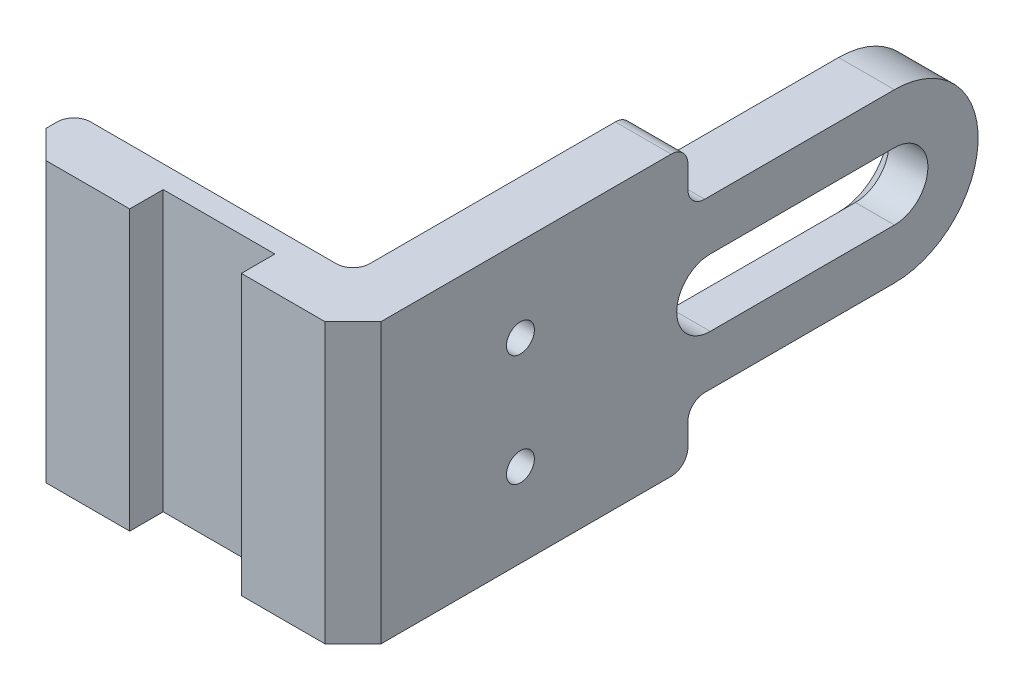
ISO-10303-21;
HEADER;
FILE_DESCRIPTION(('STEP AP214'),'2;1');
FILE_NAME('part.step','',(''),(''),'','','');
FILE_SCHEMA(('AUTOMOTIVE_DESIGN { 1 0 10303 214 1 1 1 1 }'));
ENDSEC;
DATA;
#1=APPLICATION_CONTEXT('core data for automotive mechanical design processes');
#2=APPLICATION_PROTOCOL_DEFINITION('international standard','automotive_design',2000,#1);
#3=PRODUCT_CONTEXT('',#1,'mechanical');
#4=PRODUCT('Part','Part','',(#3));
#5=PRODUCT_RELATED_PRODUCT_CATEGORY('part','',(#4));
#6=PRODUCT_DEFINITION_FORMATION('','',#4);
#7=PRODUCT_DEFINITION_CONTEXT('part definition',#1,'design');
#8=PRODUCT_DEFINITION('design','',#6,#7);
#9=PRODUCT_DEFINITION_SHAPE('','',#8);
#10=(LENGTH_UNIT() NAMED_UNIT(*) SI_UNIT(.MILLI.,.METRE.));
#11=(NAMED_UNIT(*) PLANE_ANGLE_UNIT() SI_UNIT($,.RADIAN.));
#12=(NAMED_UNIT(*) SI_UNIT($,.STERADIAN.) SOLID_ANGLE_UNIT());
#13=UNCERTAINTY_MEASURE_WITH_UNIT(LENGTH_MEASURE(1.E-05),#10,'distance_accuracy_value','');
#14=(GEOMETRIC_REPRESENTATION_CONTEXT(3) GLOBAL_UNCERTAINTY_ASSIGNED_CONTEXT((#13)) GLOBAL_UNIT_ASSIGNED_CONTEXT((#10,
#11,#12)) REPRESENTATION_CONTEXT('',''));
#15=CARTESIAN_POINT('',(0.,0.,0.));
#16=DIRECTION('',(0.,0.,1.));
#17=DIRECTION('',(1.,0.,0.));
#18=AXIS2_PLACEMENT_3D('',#15,#16,#17);
#19=CARTESIAN_POINT('',(0.,25.,0.));
#20=DIRECTION('',(0.,0.,1.));
#21=DIRECTION('',(1.,0.,0.));
#22=AXIS2_PLACEMENT_3D('',#19,#20,#21);
#23=PLANE('',#22);
#24=DIRECTION('',(-1.,0.,0.));
#25=VECTOR('',#24,1.);
#26=CARTESIAN_POINT('',(0.,0.,0.));
#27=LINE('',#26,#25);
#28=CARTESIAN_POINT('',(-2.50000000000002,0.,0.));
#29=VERTEX_POINT('',#28);
#30=CARTESIAN_POINT('',(-10.,0.,0.));
#31=VERTEX_POINT('',#30);
#32=EDGE_CURVE('E247',#29,#31,#27,.T.);
#33=ORIENTED_EDGE('',*,*,#32,.F.);
#34=DIRECTION('',(0.,1.,0.));
#35=VECTOR('',#34,1.);
#36=CARTESIAN_POINT('',(-2.50000000000002,25.,0.));
#37=LINE('',#36,#35);
#38=CARTESIAN_POINT('',(-2.50000000000002,25.,0.));
#39=VERTEX_POINT('',#38);
#40=EDGE_CURVE('E407',#29,#39,#37,.T.);
#41=ORIENTED_EDGE('',*,*,#40,.T.);
#42=DIRECTION('',(-1.,0.,0.));
#43=VECTOR('',#42,1.);
#44=CARTESIAN_POINT('',(0.,25.,0.));
#45=LINE('',#44,#43);
#46=CARTESIAN_POINT('',(-10.,25.,0.));
#47=VERTEX_POINT('',#46);
#48=EDGE_CURVE('E330',#39,#47,#45,.T.);
#49=ORIENTED_EDGE('',*,*,#48,.T.);
#50=DIRECTION('',(0.,1.,0.));
#51=VECTOR('',#50,1.);
#52=CARTESIAN_POINT('',(-10.,0.,0.));
#53=LINE('',#52,#51);
#54=EDGE_CURVE('E242',#31,#47,#53,.T.);
#55=ORIENTED_EDGE('',*,*,#54,.F.);
#56=EDGE_LOOP('',(#33,#41,#49,#55));
#57=FACE_BOUND('',#56,.T.);
#58=ADVANCED_FACE('F35',(#57),#23,.T.);
#59=CARTESIAN_POINT('',(0.,25.,0.));
#60=DIRECTION('',(0.,-1.,0.));
#61=DIRECTION('',(0.,0.,-1.));
#62=AXIS2_PLACEMENT_3D('',#59,#60,#61);
#63=PLANE('',#62);
#64=DIRECTION('',(-1.,0.,0.));
#65=VECTOR('',#64,1.);
#66=CARTESIAN_POINT('',(-5.,25.,-5.));
#67=LINE('',#66,#65);
#68=CARTESIAN_POINT('',(-6.5,25.,-5.));
#69=VERTEX_POINT('',#68);
#70=CARTESIAN_POINT('',(-28.5,25.,-5.));
#71=VERTEX_POINT('',#70);
#72=EDGE_CURVE('E336',#69,#71,#67,.T.);
#73=ORIENTED_EDGE('',*,*,#72,.T.);
#74=CARTESIAN_POINT('',(-28.5,25.,-3.5));
#75=DIRECTION('',(0.,-1.,0.));
#76=DIRECTION('',(0.,0.,-1.));
#77=AXIS2_PLACEMENT_3D('',#74,#75,#76);
#78=CIRCLE('',#77,1.5);
#79=CARTESIAN_POINT('',(-30.,25.,-3.5));
#80=VERTEX_POINT('',#79);
#81=EDGE_CURVE('E428',#71,#80,#78,.F.);
#82=ORIENTED_EDGE('',*,*,#81,.T.);
#83=DIRECTION('',(0.,0.,-1.));
#84=VECTOR('',#83,1.);
#85=CARTESIAN_POINT('',(-30.,25.,0.));
#86=LINE('',#85,#84);
#87=CARTESIAN_POINT('',(-30.,25.,-2.50000000000001));
#88=VERTEX_POINT('',#87);
#89=EDGE_CURVE('E332',#88,#80,#86,.T.);
#90=ORIENTED_EDGE('',*,*,#89,.F.);
#91=DIRECTION('',(-0.707106781186546,0.,-0.707106781186549));
#92=VECTOR('',#91,1.);
#93=CARTESIAN_POINT('',(-27.5,25.,0.));
#94=LINE('',#93,#92);
#95=CARTESIAN_POINT('',(-27.5,25.,0.));
#96=VERTEX_POINT('',#95);
#97=EDGE_CURVE('E409',#88,#96,#94,.F.);
#98=ORIENTED_EDGE('',*,*,#97,.T.);
#99=CARTESIAN_POINT('',(-20.,25.,0.));
#100=VERTEX_POINT('',#99);
#101=EDGE_CURVE('E333',#100,#96,#45,.T.);
#102=ORIENTED_EDGE('',*,*,#101,.F.);
#103=DIRECTION('',(0.,0.,1.));
#104=VECTOR('',#103,1.);
#105=CARTESIAN_POINT('',(-20.,25.,-3.));
#106=LINE('',#105,#104);
#107=CARTESIAN_POINT('',(-20.,25.,-3.));
#108=VERTEX_POINT('',#107);
#109=EDGE_CURVE('E232',#108,#100,#106,.T.);
#110=ORIENTED_EDGE('',*,*,#109,.F.);
#111=DIRECTION('',(1.,0.,0.));
#112=VECTOR('',#111,1.);
#113=CARTESIAN_POINT('',(-20.,25.,-3.));
#114=LINE('',#113,#112);
#115=CARTESIAN_POINT('',(-10.,25.,-3.));
#116=VERTEX_POINT('',#115);
#117=EDGE_CURVE('E252',#108,#116,#114,.T.);
#118=ORIENTED_EDGE('',*,*,#117,.T.);
#119=DIRECTION('',(0.,0.,1.));
#120=VECTOR('',#119,1.);
#121=CARTESIAN_POINT('',(-10.,25.,-3.));
#122=LINE('',#121,#120);
#123=EDGE_CURVE('E240',#116,#47,#122,.T.);
#124=ORIENTED_EDGE('',*,*,#123,.T.);
#125=ORIENTED_EDGE('',*,*,#48,.F.);
#126=DIRECTION('',(0.707106781186549,0.,-0.707106781186546));
#127=VECTOR('',#126,1.);
#128=CARTESIAN_POINT('',(0.,25.,-2.50000000000001));
#129=LINE('',#128,#127);
#130=CARTESIAN_POINT('',(0.,25.,-2.50000000000001));
#131=VERTEX_POINT('',#130);
#132=EDGE_CURVE('E411',#39,#131,#129,.T.);
#133=ORIENTED_EDGE('',*,*,#132,.T.);
#134=DIRECTION('',(0.,0.,-1.));
#135=VECTOR('',#134,1.);
#136=CARTESIAN_POINT('',(0.,25.,0.));
#137=LINE('',#136,#135);
#138=CARTESIAN_POINT('',(0.,25.,-28.5));
#139=VERTEX_POINT('',#138);
#140=EDGE_CURVE('E341',#131,#139,#137,.T.);
#141=ORIENTED_EDGE('',*,*,#140,.T.);
#142=DIRECTION('',(-1.,0.,0.));
#143=VECTOR('',#142,1.);
#144=CARTESIAN_POINT('',(0.,25.,-28.5));
#145=LINE('',#144,#143);
#146=CARTESIAN_POINT('',(-5.,25.,-28.5));
#147=VERTEX_POINT('',#146);
#148=EDGE_CURVE('E389',#139,#147,#145,.T.);
#149=ORIENTED_EDGE('',*,*,#148,.T.);
#150=DIRECTION('',(0.,0.,-1.));
#151=VECTOR('',#150,1.);
#152=CARTESIAN_POINT('',(-5.,25.,-5.));
#153=LINE('',#152,#151);
#154=CARTESIAN_POINT('',(-5.,25.,-6.5));
#155=VERTEX_POINT('',#154);
#156=EDGE_CURVE('E339',#155,#147,#153,.T.);
#157=ORIENTED_EDGE('',*,*,#156,.F.);
#158=CARTESIAN_POINT('',(-6.5,25.,-6.5));
#159=DIRECTION('',(0.,-1.,0.));
#160=DIRECTION('',(0.,0.,-1.));
#161=AXIS2_PLACEMENT_3D('',#158,#159,#160);
#162=CIRCLE('',#161,1.5);
#163=EDGE_CURVE('E434',#155,#69,#162,.T.);
#164=ORIENTED_EDGE('',*,*,#163,.T.);
#165=EDGE_LOOP('',(#73,#82,#90,#98,#102,#110,#118,#124,#125,#133,#141,#149,#157,#164));
#166=FACE_BOUND('',#165,.T.);
#167=ADVANCED_FACE('F502',(#166),#63,.F.);
#168=CARTESIAN_POINT('',(0.,0.,0.));
#169=DIRECTION('',(0.,-1.,0.));
#170=DIRECTION('',(0.,0.,-1.));
#171=AXIS2_PLACEMENT_3D('',#168,#169,#170);
#172=PLANE('',#171);
#173=DIRECTION('',(0.,0.,-1.));
#174=VECTOR('',#173,1.);
#175=CARTESIAN_POINT('',(-30.,0.,0.));
#176=LINE('',#175,#174);
#177=CARTESIAN_POINT('',(-30.,0.,-2.50000000000001));
#178=VERTEX_POINT('',#177);
#179=CARTESIAN_POINT('',(-30.,0.,-3.5));
#180=VERTEX_POINT('',#179);
#181=EDGE_CURVE('E345',#178,#180,#176,.T.);
#182=ORIENTED_EDGE('',*,*,#181,.T.);
#183=CARTESIAN_POINT('',(-28.5,0.,-3.5));
#184=DIRECTION('',(0.,-1.,0.));
#185=DIRECTION('',(0.,0.,-1.));
#186=AXIS2_PLACEMENT_3D('',#183,#184,#185);
#187=CIRCLE('',#186,1.5);
#188=CARTESIAN_POINT('',(-28.5,0.,-5.));
#189=VERTEX_POINT('',#188);
#190=EDGE_CURVE('E421',#180,#189,#187,.T.);
#191=ORIENTED_EDGE('',*,*,#190,.T.);
#192=DIRECTION('',(-1.,0.,0.));
#193=VECTOR('',#192,1.);
#194=CARTESIAN_POINT('',(-5.,0.,-5.));
#195=LINE('',#194,#193);
#196=CARTESIAN_POINT('',(-6.5,0.,-5.));
#197=VERTEX_POINT('',#196);
#198=EDGE_CURVE('E347',#197,#189,#195,.T.);
#199=ORIENTED_EDGE('',*,*,#198,.F.);
#200=CARTESIAN_POINT('',(-6.5,0.,-6.5));
#201=DIRECTION('',(0.,-1.,0.));
#202=DIRECTION('',(0.,0.,-1.));
#203=AXIS2_PLACEMENT_3D('',#200,#201,#202);
#204=CIRCLE('',#203,1.5);
#205=CARTESIAN_POINT('',(-5.,0.,-6.5));
#206=VERTEX_POINT('',#205);
#207=EDGE_CURVE('E432',#197,#206,#204,.F.);
#208=ORIENTED_EDGE('',*,*,#207,.T.);
#209=DIRECTION('',(0.,0.,-1.));
#210=VECTOR('',#209,1.);
#211=CARTESIAN_POINT('',(-5.,0.,-5.));
#212=LINE('',#211,#210);
#213=CARTESIAN_POINT('',(-5.,0.,-28.5));
#214=VERTEX_POINT('',#213);
#215=EDGE_CURVE('E350',#206,#214,#212,.T.);
#216=ORIENTED_EDGE('',*,*,#215,.T.);
#217=DIRECTION('',(-1.,0.,0.));
#218=VECTOR('',#217,1.);
#219=CARTESIAN_POINT('',(0.,0.,-28.5));
#220=LINE('',#219,#218);
#221=CARTESIAN_POINT('',(0.,0.,-28.5));
#222=VERTEX_POINT('',#221);
#223=EDGE_CURVE('E381',#214,#222,#220,.F.);
#224=ORIENTED_EDGE('',*,*,#223,.T.);
#225=DIRECTION('',(0.,0.,-1.));
#226=VECTOR('',#225,1.);
#227=CARTESIAN_POINT('',(0.,0.,0.));
#228=LINE('',#227,#226);
#229=CARTESIAN_POINT('',(0.,0.,-2.50000000000001));
#230=VERTEX_POINT('',#229);
#231=EDGE_CURVE('E352',#230,#222,#228,.T.);
#232=ORIENTED_EDGE('',*,*,#231,.F.);
#233=DIRECTION('',(-0.707106781186549,0.,0.707106781186546));
#234=VECTOR('',#233,1.);
#235=CARTESIAN_POINT('',(-1.25,0.,-1.25000000000001));
#236=LINE('',#235,#234);
#237=EDGE_CURVE('E405',#230,#29,#236,.T.);
#238=ORIENTED_EDGE('',*,*,#237,.T.);
#239=ORIENTED_EDGE('',*,*,#32,.T.);
#240=DIRECTION('',(0.,0.,1.));
#241=VECTOR('',#240,1.);
#242=CARTESIAN_POINT('',(-10.,0.,-3.));
#243=LINE('',#242,#241);
#244=CARTESIAN_POINT('',(-10.,0.,-3.));
#245=VERTEX_POINT('',#244);
#246=EDGE_CURVE('E231',#245,#31,#243,.T.);
#247=ORIENTED_EDGE('',*,*,#246,.F.);
#248=DIRECTION('',(1.,0.,0.));
#249=VECTOR('',#248,1.);
#250=CARTESIAN_POINT('',(-20.,0.,-3.));
#251=LINE('',#250,#249);
#252=CARTESIAN_POINT('',(-20.,0.,-3.));
#253=VERTEX_POINT('',#252);
#254=EDGE_CURVE('E220',#253,#245,#251,.T.);
#255=ORIENTED_EDGE('',*,*,#254,.F.);
#256=DIRECTION('',(0.,0.,1.));
#257=VECTOR('',#256,1.);
#258=CARTESIAN_POINT('',(-20.,0.,-3.));
#259=LINE('',#258,#257);
#260=CARTESIAN_POINT('',(-20.,0.,0.));
#261=VERTEX_POINT('',#260);
#262=EDGE_CURVE('E248',#253,#261,#259,.T.);
#263=ORIENTED_EDGE('',*,*,#262,.T.);
#264=CARTESIAN_POINT('',(-27.5,0.,0.));
#265=VERTEX_POINT('',#264);
#266=EDGE_CURVE('E329',#261,#265,#27,.T.);
#267=ORIENTED_EDGE('',*,*,#266,.T.);
#268=DIRECTION('',(0.707106781186546,0.,0.707106781186549));
#269=VECTOR('',#268,1.);
#270=CARTESIAN_POINT('',(-13.7500000000001,0.,13.75));
#271=LINE('',#270,#269);
#272=EDGE_CURVE('E403',#265,#178,#271,.F.);
#273=ORIENTED_EDGE('',*,*,#272,.T.);
#274=EDGE_LOOP('',(#182,#191,#199,#208,#216,#224,#232,#238,#239,#247,#255,#263,#267,#273));
#275=FACE_BOUND('',#274,.T.);
#276=ADVANCED_FACE('F245',(#275),#172,.T.);
#277=CARTESIAN_POINT('',(0.,25.,0.));
#278=DIRECTION('',(-1.,0.,0.));
#279=DIRECTION('',(0.,0.,1.));
#280=AXIS2_PLACEMENT_3D('',#277,#278,#279);
#281=PLANE('',#280);
#282=CARTESIAN_POINT('',(0.,17.5,-15.));
#283=DIRECTION('',(1.,0.,0.));
#284=DIRECTION('',(0.,0.,-1.));
#285=AXIS2_PLACEMENT_3D('',#282,#283,#284);
#286=CIRCLE('',#285,1.25);
#287=CARTESIAN_POINT('',(0.,17.5,-16.25));
#288=VERTEX_POINT('',#287);
#289=EDGE_CURVE('E279',#288,#288,#286,.T.);
#290=ORIENTED_EDGE('',*,*,#289,.F.);
#291=EDGE_LOOP('',(#290));
#292=FACE_BOUND('',#291,.T.);
#293=CARTESIAN_POINT('',(0.,7.5,-15.));
#294=DIRECTION('',(1.,0.,0.));
#295=DIRECTION('',(0.,0.,-1.));
#296=AXIS2_PLACEMENT_3D('',#293,#294,#295);
#297=CIRCLE('',#296,1.25);
#298=CARTESIAN_POINT('',(0.,7.5,-16.25));
#299=VERTEX_POINT('',#298);
#300=EDGE_CURVE('E269',#299,#299,#297,.T.);
#301=ORIENTED_EDGE('',*,*,#300,.F.);
#302=EDGE_LOOP('',(#301));
#303=FACE_BOUND('',#302,.T.);
#304=DIRECTION('',(0.,0.,-1.));
#305=VECTOR('',#304,1.);
#306=CARTESIAN_POINT('',(0.,9.5,-32.));
#307=LINE('',#306,#305);
#308=CARTESIAN_POINT('',(0.,9.5,-32.));
#309=VERTEX_POINT('',#308);
#310=CARTESIAN_POINT('',(0.,9.5,-48.5));
#311=VERTEX_POINT('',#310);
#312=EDGE_CURVE('E287',#309,#311,#307,.T.);
#313=ORIENTED_EDGE('',*,*,#312,.F.);
#314=CARTESIAN_POINT('',(0.,12.5,-32.));
#315=DIRECTION('',(1.,0.,0.));
#316=DIRECTION('',(0.,0.,-1.));
#317=AXIS2_PLACEMENT_3D('',#314,#315,#316);
#318=CIRCLE('',#317,3.);
#319=CARTESIAN_POINT('',(0.,15.5,-32.));
#320=VERTEX_POINT('',#319);
#321=EDGE_CURVE('E282',#320,#309,#318,.T.);
#322=ORIENTED_EDGE('',*,*,#321,.F.);
#323=DIRECTION('',(0.,0.,-1.));
#324=VECTOR('',#323,1.);
#325=CARTESIAN_POINT('',(0.,15.5,-32.));
#326=LINE('',#325,#324);
#327=CARTESIAN_POINT('',(0.,15.5,-48.5));
#328=VERTEX_POINT('',#327);
#329=EDGE_CURVE('E293',#320,#328,#326,.T.);
#330=ORIENTED_EDGE('',*,*,#329,.T.);
#331=CARTESIAN_POINT('',(0.,12.5,-48.5));
#332=DIRECTION('',(1.,0.,0.));
#333=DIRECTION('',(0.,0.,-1.));
#334=AXIS2_PLACEMENT_3D('',#331,#332,#333);
#335=CIRCLE('',#334,3.);
#336=EDGE_CURVE('E290',#311,#328,#335,.T.);
#337=ORIENTED_EDGE('',*,*,#336,.F.);
#338=EDGE_LOOP('',(#313,#322,#330,#337));
#339=FACE_BOUND('',#338,.T.);
#340=ORIENTED_EDGE('',*,*,#140,.F.);
#341=DIRECTION('',(0.,-1.,0.));
#342=VECTOR('',#341,1.);
#343=CARTESIAN_POINT('',(0.,0.,-2.50000000000001));
#344=LINE('',#343,#342);
#345=EDGE_CURVE('E400',#131,#230,#344,.T.);
#346=ORIENTED_EDGE('',*,*,#345,.T.);
#347=ORIENTED_EDGE('',*,*,#231,.T.);
#348=CARTESIAN_POINT('',(0.,1.5,-28.5));
#349=DIRECTION('',(-1.,0.,0.));
#350=DIRECTION('',(0.,0.,1.));
#351=AXIS2_PLACEMENT_3D('',#348,#349,#350);
#352=CIRCLE('',#351,1.5);
#353=CARTESIAN_POINT('',(0.,1.5,-30.));
#354=VERTEX_POINT('',#353);
#355=EDGE_CURVE('E387',#222,#354,#352,.F.);
#356=ORIENTED_EDGE('',*,*,#355,.T.);
#357=DIRECTION('',(0.,-1.,0.));
#358=VECTOR('',#357,1.);
#359=CARTESIAN_POINT('',(0.,0.,-30.));
#360=LINE('',#359,#358);
#361=CARTESIAN_POINT('',(0.,3.5,-30.));
#362=VERTEX_POINT('',#361);
#363=EDGE_CURVE('E306',#362,#354,#360,.T.);
#364=ORIENTED_EDGE('',*,*,#363,.F.);
#365=CARTESIAN_POINT('',(0.,3.5,-31.5));
#366=DIRECTION('',(-1.,0.,0.));
#367=DIRECTION('',(0.,0.,1.));
#368=AXIS2_PLACEMENT_3D('',#365,#366,#367);
#369=CIRCLE('',#368,1.5);
#370=CARTESIAN_POINT('',(0.,5.,-31.5));
#371=VERTEX_POINT('',#370);
#372=EDGE_CURVE('E396',#362,#371,#369,.T.);
#373=ORIENTED_EDGE('',*,*,#372,.T.);
#374=DIRECTION('',(0.,0.,-1.));
#375=VECTOR('',#374,1.);
#376=CARTESIAN_POINT('',(0.,5.,0.));
#377=LINE('',#376,#375);
#378=CARTESIAN_POINT('',(0.,5.,-48.5));
#379=VERTEX_POINT('',#378);
#380=EDGE_CURVE('E299',#371,#379,#377,.T.);
#381=ORIENTED_EDGE('',*,*,#380,.T.);
#382=CARTESIAN_POINT('',(0.,12.5,-48.5));
#383=DIRECTION('',(1.,0.,0.));
#384=DIRECTION('',(0.,0.,-1.));
#385=AXIS2_PLACEMENT_3D('',#382,#383,#384);
#386=CIRCLE('',#385,7.5);
#387=CARTESIAN_POINT('',(0.,20.,-48.5));
#388=VERTEX_POINT('',#387);
#389=EDGE_CURVE('E320',#379,#388,#386,.T.);
#390=ORIENTED_EDGE('',*,*,#389,.T.);
#391=DIRECTION('',(0.,0.,-1.));
#392=VECTOR('',#391,1.);
#393=CARTESIAN_POINT('',(0.,20.,0.));
#394=LINE('',#393,#392);
#395=CARTESIAN_POINT('',(0.,20.,-31.5));
#396=VERTEX_POINT('',#395);
#397=EDGE_CURVE('E318',#396,#388,#394,.T.);
#398=ORIENTED_EDGE('',*,*,#397,.F.);
#399=CARTESIAN_POINT('',(0.,21.5,-31.5));
#400=DIRECTION('',(-1.,0.,0.));
#401=DIRECTION('',(0.,0.,1.));
#402=AXIS2_PLACEMENT_3D('',#399,#400,#401);
#403=CIRCLE('',#402,1.5);
#404=CARTESIAN_POINT('',(0.,21.5,-30.));
#405=VERTEX_POINT('',#404);
#406=EDGE_CURVE('E392',#396,#405,#403,.T.);
#407=ORIENTED_EDGE('',*,*,#406,.T.);
#408=DIRECTION('',(0.,-1.,0.));
#409=VECTOR('',#408,1.);
#410=CARTESIAN_POINT('',(0.,0.,-30.));
#411=LINE('',#410,#409);
#412=CARTESIAN_POINT('',(0.,23.5,-30.));
#413=VERTEX_POINT('',#412);
#414=EDGE_CURVE('E315',#413,#405,#411,.T.);
#415=ORIENTED_EDGE('',*,*,#414,.F.);
#416=CARTESIAN_POINT('',(0.,23.5,-28.5));
#417=DIRECTION('',(-1.,0.,0.));
#418=DIRECTION('',(0.,0.,1.));
#419=AXIS2_PLACEMENT_3D('',#416,#417,#418);
#420=CIRCLE('',#419,1.5);
#421=EDGE_CURVE('E384',#413,#139,#420,.F.);
#422=ORIENTED_EDGE('',*,*,#421,.T.);
#423=EDGE_LOOP('',(#340,#346,#347,#356,#364,#373,#381,#390,#398,#407,#415,#422));
#424=FACE_BOUND('',#423,.T.);
#425=ADVANCED_FACE('F486',(#292,#303,#339,#424),#281,.F.);
#426=CARTESIAN_POINT('',(-5.,25.,-5.));
#427=DIRECTION('',(-1.,0.,0.));
#428=DIRECTION('',(0.,0.,1.));
#429=AXIS2_PLACEMENT_3D('',#426,#427,#428);
#430=PLANE('',#429);
#431=CARTESIAN_POINT('',(-5.,12.5,-32.));
#432=DIRECTION('',(-1.,0.,0.));
#433=DIRECTION('',(0.,0.,1.));
#434=AXIS2_PLACEMENT_3D('',#431,#432,#433);
#435=CIRCLE('',#434,4.5);
#436=CARTESIAN_POINT('',(-5.,17.,-32.));
#437=VERTEX_POINT('',#436);
#438=CARTESIAN_POINT('',(-5.,8.,-32.));
#439=VERTEX_POINT('',#438);
#440=EDGE_CURVE('E441',#437,#439,#435,.F.);
#441=ORIENTED_EDGE('',*,*,#440,.T.);
#442=DIRECTION('',(0.,0.,-1.));
#443=VECTOR('',#442,1.);
#444=CARTESIAN_POINT('',(-5.,8.,-48.5));
#445=LINE('',#444,#443);
#446=CARTESIAN_POINT('',(-5.,8.,-48.5));
#447=VERTEX_POINT('',#446);
#448=EDGE_CURVE('E445',#439,#447,#445,.T.);
#449=ORIENTED_EDGE('',*,*,#448,.T.);
#450=CARTESIAN_POINT('',(-5.,12.5,-48.5));
#451=DIRECTION('',(-1.,0.,0.));
#452=DIRECTION('',(0.,0.,1.));
#453=AXIS2_PLACEMENT_3D('',#450,#451,#452);
#454=CIRCLE('',#453,4.5);
#455=CARTESIAN_POINT('',(-5.,17.,-48.5));
#456=VERTEX_POINT('',#455);
#457=EDGE_CURVE('E443',#447,#456,#454,.F.);
#458=ORIENTED_EDGE('',*,*,#457,.T.);
#459=DIRECTION('',(0.,0.,1.));
#460=VECTOR('',#459,1.);
#461=CARTESIAN_POINT('',(-5.,17.,-5.));
#462=LINE('',#461,#460);
#463=EDGE_CURVE('E439',#456,#437,#462,.T.);
#464=ORIENTED_EDGE('',*,*,#463,.T.);
#465=EDGE_LOOP('',(#441,#449,#458,#464));
#466=FACE_BOUND('',#465,.T.);
#467=CARTESIAN_POINT('',(-5.,17.5,-15.));
#468=DIRECTION('',(1.,0.,0.));
#469=DIRECTION('',(0.,0.,-1.));
#470=AXIS2_PLACEMENT_3D('',#467,#468,#469);
#471=CIRCLE('',#470,3.);
#472=CARTESIAN_POINT('',(-5.,17.5,-18.));
#473=VERTEX_POINT('',#472);
#474=EDGE_CURVE('E266',#473,#473,#471,.T.);
#475=ORIENTED_EDGE('',*,*,#474,.T.);
#476=EDGE_LOOP('',(#475));
#477=FACE_BOUND('',#476,.T.);
#478=CARTESIAN_POINT('',(-5.,7.5,-15.));
#479=DIRECTION('',(1.,0.,0.));
#480=DIRECTION('',(0.,0.,-1.));
#481=AXIS2_PLACEMENT_3D('',#478,#479,#480);
#482=CIRCLE('',#481,3.);
#483=CARTESIAN_POINT('',(-5.,7.5,-18.));
#484=VERTEX_POINT('',#483);
#485=EDGE_CURVE('E265',#484,#484,#482,.T.);
#486=ORIENTED_EDGE('',*,*,#485,.T.);
#487=EDGE_LOOP('',(#486));
#488=FACE_BOUND('',#487,.T.);
#489=ORIENTED_EDGE('',*,*,#215,.F.);
#490=DIRECTION('',(0.,-1.,0.));
#491=VECTOR('',#490,1.);
#492=CARTESIAN_POINT('',(-5.,25.,-6.5));
#493=LINE('',#492,#491);
#494=EDGE_CURVE('E430',#206,#155,#493,.F.);
#495=ORIENTED_EDGE('',*,*,#494,.T.);
#496=ORIENTED_EDGE('',*,*,#156,.T.);
#497=CARTESIAN_POINT('',(-5.,23.5,-28.5));
#498=DIRECTION('',(-1.,0.,0.));
#499=DIRECTION('',(0.,0.,1.));
#500=AXIS2_PLACEMENT_3D('',#497,#498,#499);
#501=CIRCLE('',#500,1.5);
#502=CARTESIAN_POINT('',(-5.,23.5,-30.));
#503=VERTEX_POINT('',#502);
#504=EDGE_CURVE('E376',#147,#503,#501,.T.);
#505=ORIENTED_EDGE('',*,*,#504,.T.);
#506=DIRECTION('',(0.,1.,0.));
#507=VECTOR('',#506,1.);
#508=CARTESIAN_POINT('',(-5.,25.,-30.));
#509=LINE('',#508,#507);
#510=CARTESIAN_POINT('',(-5.,21.5,-30.));
#511=VERTEX_POINT('',#510);
#512=EDGE_CURVE('E326',#511,#503,#509,.T.);
#513=ORIENTED_EDGE('',*,*,#512,.F.);
#514=CARTESIAN_POINT('',(-5.,21.5,-31.5));
#515=DIRECTION('',(-1.,0.,0.));
#516=DIRECTION('',(0.,0.,1.));
#517=AXIS2_PLACEMENT_3D('',#514,#515,#516);
#518=CIRCLE('',#517,1.5);
#519=CARTESIAN_POINT('',(-5.,20.,-31.5));
#520=VERTEX_POINT('',#519);
#521=EDGE_CURVE('E394',#511,#520,#518,.F.);
#522=ORIENTED_EDGE('',*,*,#521,.T.);
#523=DIRECTION('',(0.,0.,1.));
#524=VECTOR('',#523,1.);
#525=CARTESIAN_POINT('',(-5.,20.,-5.));
#526=LINE('',#525,#524);
#527=CARTESIAN_POINT('',(-5.,20.,-48.5));
#528=VERTEX_POINT('',#527);
#529=EDGE_CURVE('E343',#528,#520,#526,.T.);
#530=ORIENTED_EDGE('',*,*,#529,.F.);
#531=CARTESIAN_POINT('',(-5.,12.5,-48.5));
#532=DIRECTION('',(-1.,0.,0.));
#533=DIRECTION('',(0.,0.,1.));
#534=AXIS2_PLACEMENT_3D('',#531,#532,#533);
#535=CIRCLE('',#534,7.5);
#536=CARTESIAN_POINT('',(-5.,5.,-48.5));
#537=VERTEX_POINT('',#536);
#538=EDGE_CURVE('E356',#528,#537,#535,.T.);
#539=ORIENTED_EDGE('',*,*,#538,.T.);
#540=DIRECTION('',(0.,0.,1.));
#541=VECTOR('',#540,1.);
#542=CARTESIAN_POINT('',(-5.,5.,-5.));
#543=LINE('',#542,#541);
#544=CARTESIAN_POINT('',(-5.,5.,-31.5));
#545=VERTEX_POINT('',#544);
#546=EDGE_CURVE('E358',#537,#545,#543,.T.);
#547=ORIENTED_EDGE('',*,*,#546,.T.);
#548=CARTESIAN_POINT('',(-5.,3.5,-31.5));
#549=DIRECTION('',(-1.,0.,0.));
#550=DIRECTION('',(0.,0.,1.));
#551=AXIS2_PLACEMENT_3D('',#548,#549,#550);
#552=CIRCLE('',#551,1.5);
#553=CARTESIAN_POINT('',(-5.,3.5,-30.));
#554=VERTEX_POINT('',#553);
#555=EDGE_CURVE('E398',#545,#554,#552,.F.);
#556=ORIENTED_EDGE('',*,*,#555,.T.);
#557=DIRECTION('',(0.,1.,0.));
#558=VECTOR('',#557,1.);
#559=CARTESIAN_POINT('',(-5.,25.,-30.));
#560=LINE('',#559,#558);
#561=CARTESIAN_POINT('',(-5.,1.5,-30.));
#562=VERTEX_POINT('',#561);
#563=EDGE_CURVE('E312',#562,#554,#560,.T.);
#564=ORIENTED_EDGE('',*,*,#563,.F.);
#565=CARTESIAN_POINT('',(-5.,1.5,-28.5));
#566=DIRECTION('',(-1.,0.,0.));
#567=DIRECTION('',(0.,0.,1.));
#568=AXIS2_PLACEMENT_3D('',#565,#566,#567);
#569=CIRCLE('',#568,1.5);
#570=EDGE_CURVE('E378',#562,#214,#569,.T.);
#571=ORIENTED_EDGE('',*,*,#570,.T.);
#572=EDGE_LOOP('',(#489,#495,#496,#505,#513,#522,#530,#539,#547,#556,#564,#571));
#573=FACE_BOUND('',#572,.T.);
#574=ADVANCED_FACE('F469',(#466,#477,#488,#573),#430,.T.);
#575=ORIENTED_EDGE('',*,*,#101,.T.);
#576=DIRECTION('',(0.,-1.,0.));
#577=VECTOR('',#576,1.);
#578=CARTESIAN_POINT('',(-27.5,25.,0.));
#579=LINE('',#578,#577);
#580=EDGE_CURVE('E413',#96,#265,#579,.T.);
#581=ORIENTED_EDGE('',*,*,#580,.T.);
#582=ORIENTED_EDGE('',*,*,#266,.F.);
#583=DIRECTION('',(0.,1.,0.));
#584=VECTOR('',#583,1.);
#585=CARTESIAN_POINT('',(-20.,0.,0.));
#586=LINE('',#585,#584);
#587=EDGE_CURVE('E257',#261,#100,#586,.T.);
#588=ORIENTED_EDGE('',*,*,#587,.T.);
#589=EDGE_LOOP('',(#575,#581,#582,#588));
#590=FACE_BOUND('',#589,.T.);
#591=ADVANCED_FACE('F505',(#590),#23,.T.);
#592=CARTESIAN_POINT('',(-5.,25.,-5.));
#593=DIRECTION('',(0.,0.,1.));
#594=DIRECTION('',(1.,0.,0.));
#595=AXIS2_PLACEMENT_3D('',#592,#593,#594);
#596=PLANE('',#595);
#597=ORIENTED_EDGE('',*,*,#198,.T.);
#598=DIRECTION('',(0.,-1.,0.));
#599=VECTOR('',#598,1.);
#600=CARTESIAN_POINT('',(-28.5,25.,-5.));
#601=LINE('',#600,#599);
#602=EDGE_CURVE('E426',#189,#71,#601,.F.);
#603=ORIENTED_EDGE('',*,*,#602,.T.);
#604=ORIENTED_EDGE('',*,*,#72,.F.);
#605=DIRECTION('',(0.,-1.,0.));
#606=VECTOR('',#605,1.);
#607=CARTESIAN_POINT('',(-6.5,25.,-5.));
#608=LINE('',#607,#606);
#609=EDGE_CURVE('E423',#69,#197,#608,.T.);
#610=ORIENTED_EDGE('',*,*,#609,.T.);
#611=EDGE_LOOP('',(#597,#603,#604,#610));
#612=FACE_BOUND('',#611,.T.);
#613=ADVANCED_FACE('F514',(#612),#596,.F.);
#614=CARTESIAN_POINT('',(-30.,25.,0.));
#615=DIRECTION('',(-1.,0.,0.));
#616=DIRECTION('',(0.,0.,1.));
#617=AXIS2_PLACEMENT_3D('',#614,#615,#616);
#618=PLANE('',#617);
#619=ORIENTED_EDGE('',*,*,#89,.T.);
#620=DIRECTION('',(0.,-1.,0.));
#621=VECTOR('',#620,1.);
#622=CARTESIAN_POINT('',(-30.,0.,-3.5));
#623=LINE('',#622,#621);
#624=EDGE_CURVE('E418',#80,#180,#623,.T.);
#625=ORIENTED_EDGE('',*,*,#624,.T.);
#626=ORIENTED_EDGE('',*,*,#181,.F.);
#627=DIRECTION('',(0.,1.,0.));
#628=VECTOR('',#627,1.);
#629=CARTESIAN_POINT('',(-30.,25.,-2.50000000000001));
#630=LINE('',#629,#628);
#631=EDGE_CURVE('E416',#178,#88,#630,.T.);
#632=ORIENTED_EDGE('',*,*,#631,.T.);
#633=EDGE_LOOP('',(#619,#625,#626,#632));
#634=FACE_BOUND('',#633,.T.);
#635=ADVANCED_FACE('F520',(#634),#618,.T.);
#636=CARTESIAN_POINT('',(-25.,12.5,-48.5));
#637=DIRECTION('',(1.,0.,0.));
#638=DIRECTION('',(0.,0.,-1.));
#639=AXIS2_PLACEMENT_3D('',#636,#637,#638);
#640=CYLINDRICAL_SURFACE('',#639,7.5);
#641=DIRECTION('',(1.,0.,0.));
#642=VECTOR('',#641,1.);
#643=CARTESIAN_POINT('',(-25.,20.,-48.5));
#644=LINE('',#643,#642);
#645=EDGE_CURVE('E323',#528,#388,#644,.T.);
#646=ORIENTED_EDGE('',*,*,#645,.T.);
#647=ORIENTED_EDGE('',*,*,#389,.F.);
#648=DIRECTION('',(1.,0.,0.));
#649=VECTOR('',#648,1.);
#650=CARTESIAN_POINT('',(-25.,5.,-48.5));
#651=LINE('',#650,#649);
#652=EDGE_CURVE('E309',#537,#379,#651,.T.);
#653=ORIENTED_EDGE('',*,*,#652,.F.);
#654=ORIENTED_EDGE('',*,*,#538,.F.);
#655=EDGE_LOOP('',(#646,#647,#653,#654));
#656=FACE_BOUND('',#655,.T.);
#657=ADVANCED_FACE('F621',(#656),#640,.T.);
#658=CARTESIAN_POINT('',(-25.,20.,0.));
#659=DIRECTION('',(0.,-1.,0.));
#660=DIRECTION('',(0.,0.,-1.));
#661=AXIS2_PLACEMENT_3D('',#658,#659,#660);
#662=PLANE('',#661);
#663=ORIENTED_EDGE('',*,*,#529,.T.);
#664=DIRECTION('',(1.,0.,0.));
#665=VECTOR('',#664,1.);
#666=CARTESIAN_POINT('',(0.,20.,-31.5));
#667=LINE('',#666,#665);
#668=EDGE_CURVE('E361',#520,#396,#667,.T.);
#669=ORIENTED_EDGE('',*,*,#668,.T.);
#670=ORIENTED_EDGE('',*,*,#397,.T.);
#671=ORIENTED_EDGE('',*,*,#645,.F.);
#672=EDGE_LOOP('',(#663,#669,#670,#671));
#673=FACE_BOUND('',#672,.T.);
#674=ADVANCED_FACE('F625',(#673),#662,.F.);
#675=CARTESIAN_POINT('',(-25.,0.,-30.));
#676=DIRECTION('',(0.,0.,1.));
#677=DIRECTION('',(1.,0.,0.));
#678=AXIS2_PLACEMENT_3D('',#675,#676,#677);
#679=PLANE('',#678);
#680=ORIENTED_EDGE('',*,*,#414,.T.);
#681=DIRECTION('',(1.,0.,0.));
#682=VECTOR('',#681,1.);
#683=CARTESIAN_POINT('',(-5.,21.5,-30.));
#684=LINE('',#683,#682);
#685=EDGE_CURVE('E366',#405,#511,#684,.F.);
#686=ORIENTED_EDGE('',*,*,#685,.T.);
#687=ORIENTED_EDGE('',*,*,#512,.T.);
#688=DIRECTION('',(-1.,0.,0.));
#689=VECTOR('',#688,1.);
#690=CARTESIAN_POINT('',(-25.,23.5,-30.));
#691=LINE('',#690,#689);
#692=EDGE_CURVE('E364',#503,#413,#691,.F.);
#693=ORIENTED_EDGE('',*,*,#692,.T.);
#694=EDGE_LOOP('',(#680,#686,#687,#693));
#695=FACE_BOUND('',#694,.T.);
#696=ADVANCED_FACE('F631',(#695),#679,.F.);
#697=CARTESIAN_POINT('',(-25.,0.,-30.));
#698=DIRECTION('',(0.,0.,1.));
#699=DIRECTION('',(1.,0.,0.));
#700=AXIS2_PLACEMENT_3D('',#697,#698,#699);
#701=PLANE('',#700);
#702=ORIENTED_EDGE('',*,*,#563,.T.);
#703=DIRECTION('',(1.,0.,0.));
#704=VECTOR('',#703,1.);
#705=CARTESIAN_POINT('',(-25.,3.5,-30.));
#706=LINE('',#705,#704);
#707=EDGE_CURVE('E371',#554,#362,#706,.T.);
#708=ORIENTED_EDGE('',*,*,#707,.T.);
#709=ORIENTED_EDGE('',*,*,#363,.T.);
#710=DIRECTION('',(-1.,0.,0.));
#711=VECTOR('',#710,1.);
#712=CARTESIAN_POINT('',(-5.,1.5,-30.));
#713=LINE('',#712,#711);
#714=EDGE_CURVE('E368',#354,#562,#713,.T.);
#715=ORIENTED_EDGE('',*,*,#714,.T.);
#716=EDGE_LOOP('',(#702,#708,#709,#715));
#717=FACE_BOUND('',#716,.T.);
#718=ADVANCED_FACE('F638',(#717),#701,.F.);
#719=CARTESIAN_POINT('',(-25.,5.,0.));
#720=DIRECTION('',(0.,-1.,0.));
#721=DIRECTION('',(0.,0.,-1.));
#722=AXIS2_PLACEMENT_3D('',#719,#720,#721);
#723=PLANE('',#722);
#724=ORIENTED_EDGE('',*,*,#380,.F.);
#725=DIRECTION('',(1.,0.,0.));
#726=VECTOR('',#725,1.);
#727=CARTESIAN_POINT('',(-25.,5.,-31.5));
#728=LINE('',#727,#726);
#729=EDGE_CURVE('E374',#371,#545,#728,.F.);
#730=ORIENTED_EDGE('',*,*,#729,.T.);
#731=ORIENTED_EDGE('',*,*,#546,.F.);
#732=ORIENTED_EDGE('',*,*,#652,.T.);
#733=EDGE_LOOP('',(#724,#730,#731,#732));
#734=FACE_BOUND('',#733,.T.);
#735=ADVANCED_FACE('F498',(#734),#723,.T.);
#736=CARTESIAN_POINT('',(-25.,12.5,-32.));
#737=DIRECTION('',(1.,0.,0.));
#738=DIRECTION('',(0.,0.,-1.));
#739=AXIS2_PLACEMENT_3D('',#736,#737,#738);
#740=CYLINDRICAL_SURFACE('',#739,3.);
#741=DIRECTION('',(1.,0.,0.));
#742=VECTOR('',#741,1.);
#743=CARTESIAN_POINT('',(-25.,9.5,-32.));
#744=LINE('',#743,#742);
#745=CARTESIAN_POINT('',(-3.49999999999999,9.5,-32.));
#746=VERTEX_POINT('',#745);
#747=EDGE_CURVE('E296',#746,#309,#744,.T.);
#748=ORIENTED_EDGE('',*,*,#747,.F.);
#749=CARTESIAN_POINT('',(-3.49999999999999,12.5,-32.));
#750=DIRECTION('',(-1.,0.,0.));
#751=DIRECTION('',(0.,0.,1.));
#752=AXIS2_PLACEMENT_3D('',#749,#750,#751);
#753=CIRCLE('',#752,3.);
#754=CARTESIAN_POINT('',(-3.49999999999999,15.5,-32.));
#755=VERTEX_POINT('',#754);
#756=EDGE_CURVE('E44',#746,#755,#753,.T.);
#757=ORIENTED_EDGE('',*,*,#756,.T.);
#758=DIRECTION('',(1.,0.,0.));
#759=VECTOR('',#758,1.);
#760=CARTESIAN_POINT('',(-25.,15.5,-32.));
#761=LINE('',#760,#759);
#762=EDGE_CURVE('E297',#755,#320,#761,.T.);
#763=ORIENTED_EDGE('',*,*,#762,.T.);
#764=ORIENTED_EDGE('',*,*,#321,.T.);
#765=EDGE_LOOP('',(#748,#757,#763,#764));
#766=FACE_BOUND('',#765,.T.);
#767=ADVANCED_FACE('F480',(#766),#740,.F.);
#768=CARTESIAN_POINT('',(-25.,15.5,-32.));
#769=DIRECTION('',(0.,-1.,0.));
#770=DIRECTION('',(0.,0.,-1.));
#771=AXIS2_PLACEMENT_3D('',#768,#769,#770);
#772=PLANE('',#771);
#773=ORIENTED_EDGE('',*,*,#762,.F.);
#774=DIRECTION('',(0.,0.,-1.));
#775=VECTOR('',#774,1.);
#776=CARTESIAN_POINT('',(-3.49999999999999,15.5,-32.));
#777=LINE('',#776,#775);
#778=CARTESIAN_POINT('',(-3.49999999999999,15.5,-48.5));
#779=VERTEX_POINT('',#778);
#780=EDGE_CURVE('E11',#755,#779,#777,.T.);
#781=ORIENTED_EDGE('',*,*,#780,.T.);
#782=DIRECTION('',(1.,0.,0.));
#783=VECTOR('',#782,1.);
#784=CARTESIAN_POINT('',(-25.,15.5,-48.5));
#785=LINE('',#784,#783);
#786=EDGE_CURVE('E300',#779,#328,#785,.T.);
#787=ORIENTED_EDGE('',*,*,#786,.T.);
#788=ORIENTED_EDGE('',*,*,#329,.F.);
#789=EDGE_LOOP('',(#773,#781,#787,#788));
#790=FACE_BOUND('',#789,.T.);
#791=ADVANCED_FACE('F490',(#790),#772,.T.);
#792=CARTESIAN_POINT('',(-25.,12.5,-48.5));
#793=DIRECTION('',(1.,0.,0.));
#794=DIRECTION('',(0.,0.,-1.));
#795=AXIS2_PLACEMENT_3D('',#792,#793,#794);
#796=CYLINDRICAL_SURFACE('',#795,3.);
#797=ORIENTED_EDGE('',*,*,#786,.F.);
#798=CARTESIAN_POINT('',(-3.49999999999999,12.5,-48.5));
#799=DIRECTION('',(-1.,0.,0.));
#800=DIRECTION('',(0.,0.,1.));
#801=AXIS2_PLACEMENT_3D('',#798,#799,#800);
#802=CIRCLE('',#801,3.);
#803=CARTESIAN_POINT('',(-3.49999999999999,9.5,-48.5));
#804=VERTEX_POINT('',#803);
#805=EDGE_CURVE('E448',#779,#804,#802,.T.);
#806=ORIENTED_EDGE('',*,*,#805,.T.);
#807=DIRECTION('',(1.,0.,0.));
#808=VECTOR('',#807,1.);
#809=CARTESIAN_POINT('',(-25.,9.5,-48.5));
#810=LINE('',#809,#808);
#811=EDGE_CURVE('E302',#804,#311,#810,.T.);
#812=ORIENTED_EDGE('',*,*,#811,.T.);
#813=ORIENTED_EDGE('',*,*,#336,.T.);
#814=EDGE_LOOP('',(#797,#806,#812,#813));
#815=FACE_BOUND('',#814,.T.);
#816=ADVANCED_FACE('F489',(#815),#796,.F.);
#817=CARTESIAN_POINT('',(-25.,9.5,-32.));
#818=DIRECTION('',(0.,-1.,0.));
#819=DIRECTION('',(0.,0.,-1.));
#820=AXIS2_PLACEMENT_3D('',#817,#818,#819);
#821=PLANE('',#820);
#822=ORIENTED_EDGE('',*,*,#811,.F.);
#823=DIRECTION('',(0.,0.,1.));
#824=VECTOR('',#823,1.);
#825=CARTESIAN_POINT('',(-3.49999999999999,9.5,-32.));
#826=LINE('',#825,#824);
#827=EDGE_CURVE('E436',#804,#746,#826,.T.);
#828=ORIENTED_EDGE('',*,*,#827,.T.);
#829=ORIENTED_EDGE('',*,*,#747,.T.);
#830=ORIENTED_EDGE('',*,*,#312,.T.);
#831=EDGE_LOOP('',(#822,#828,#829,#830));
#832=FACE_BOUND('',#831,.T.);
#833=ADVANCED_FACE('F479',(#832),#821,.F.);
#834=CARTESIAN_POINT('',(-25.,21.5,-31.5));
#835=DIRECTION('',(-1.,0.,0.));
#836=DIRECTION('',(0.,0.,1.));
#837=AXIS2_PLACEMENT_3D('',#834,#835,#836);
#838=CYLINDRICAL_SURFACE('',#837,1.5);
#839=ORIENTED_EDGE('',*,*,#521,.F.);
#840=ORIENTED_EDGE('',*,*,#685,.F.);
#841=ORIENTED_EDGE('',*,*,#406,.F.);
#842=ORIENTED_EDGE('',*,*,#668,.F.);
#843=EDGE_LOOP('',(#839,#840,#841,#842));
#844=FACE_BOUND('',#843,.T.);
#845=ADVANCED_FACE('F651',(#844),#838,.F.);
#846=CARTESIAN_POINT('',(-25.,3.5,-31.5));
#847=DIRECTION('',(1.,0.,0.));
#848=DIRECTION('',(0.,0.,-1.));
#849=AXIS2_PLACEMENT_3D('',#846,#847,#848);
#850=CYLINDRICAL_SURFACE('',#849,1.5);
#851=ORIENTED_EDGE('',*,*,#555,.F.);
#852=ORIENTED_EDGE('',*,*,#729,.F.);
#853=ORIENTED_EDGE('',*,*,#372,.F.);
#854=ORIENTED_EDGE('',*,*,#707,.F.);
#855=EDGE_LOOP('',(#851,#852,#853,#854));
#856=FACE_BOUND('',#855,.T.);
#857=ADVANCED_FACE('F664',(#856),#850,.F.);
#858=CARTESIAN_POINT('',(-25.,1.5,-28.5));
#859=DIRECTION('',(1.,0.,0.));
#860=DIRECTION('',(0.,0.,-1.));
#861=AXIS2_PLACEMENT_3D('',#858,#859,#860);
#862=CYLINDRICAL_SURFACE('',#861,1.5);
#863=ORIENTED_EDGE('',*,*,#355,.F.);
#864=ORIENTED_EDGE('',*,*,#223,.F.);
#865=ORIENTED_EDGE('',*,*,#570,.F.);
#866=ORIENTED_EDGE('',*,*,#714,.F.);
#867=EDGE_LOOP('',(#863,#864,#865,#866));
#868=FACE_BOUND('',#867,.T.);
#869=ADVANCED_FACE('F557',(#868),#862,.T.);
#870=CARTESIAN_POINT('',(0.,23.5,-28.5));
#871=DIRECTION('',(-1.,0.,0.));
#872=DIRECTION('',(0.,0.,1.));
#873=AXIS2_PLACEMENT_3D('',#870,#871,#872);
#874=CYLINDRICAL_SURFACE('',#873,1.5);
#875=ORIENTED_EDGE('',*,*,#421,.F.);
#876=ORIENTED_EDGE('',*,*,#692,.F.);
#877=ORIENTED_EDGE('',*,*,#504,.F.);
#878=ORIENTED_EDGE('',*,*,#148,.F.);
#879=EDGE_LOOP('',(#875,#876,#877,#878));
#880=FACE_BOUND('',#879,.T.);
#881=ADVANCED_FACE('F601',(#880),#874,.T.);
#882=CARTESIAN_POINT('',(-25.,7.5,-15.));
#883=DIRECTION('',(1.,0.,0.));
#884=DIRECTION('',(0.,0.,-1.));
#885=AXIS2_PLACEMENT_3D('',#882,#883,#884);
#886=CYLINDRICAL_SURFACE('',#885,1.25);
#887=CARTESIAN_POINT('',(-2.5,7.5,-15.));
#888=DIRECTION('',(1.,0.,0.));
#889=DIRECTION('',(0.,0.,-1.));
#890=AXIS2_PLACEMENT_3D('',#887,#888,#889);
#891=CIRCLE('',#890,1.25);
#892=CARTESIAN_POINT('',(-2.5,7.5,-16.25));
#893=VERTEX_POINT('',#892);
#894=EDGE_CURVE('E241',#893,#893,#891,.T.);
#895=ORIENTED_EDGE('',*,*,#894,.F.);
#896=EDGE_LOOP('',(#895));
#897=FACE_BOUND('',#896,.T.);
#898=ORIENTED_EDGE('',*,*,#300,.T.);
#899=EDGE_LOOP('',(#898));
#900=FACE_BOUND('',#899,.T.);
#901=ADVANCED_FACE('F598',(#897,#900),#886,.F.);
#902=CARTESIAN_POINT('',(-25.,17.5,-15.));
#903=DIRECTION('',(1.,0.,0.));
#904=DIRECTION('',(0.,0.,-1.));
#905=AXIS2_PLACEMENT_3D('',#902,#903,#904);
#906=CYLINDRICAL_SURFACE('',#905,1.25);
#907=CARTESIAN_POINT('',(-2.5,17.5,-15.));
#908=DIRECTION('',(1.,0.,0.));
#909=DIRECTION('',(0.,0.,-1.));
#910=AXIS2_PLACEMENT_3D('',#907,#908,#909);
#911=CIRCLE('',#910,1.25);
#912=CARTESIAN_POINT('',(-2.5,17.5,-16.25));
#913=VERTEX_POINT('',#912);
#914=EDGE_CURVE('E261',#913,#913,#911,.T.);
#915=ORIENTED_EDGE('',*,*,#914,.F.);
#916=EDGE_LOOP('',(#915));
#917=FACE_BOUND('',#916,.T.);
#918=ORIENTED_EDGE('',*,*,#289,.T.);
#919=EDGE_LOOP('',(#918));
#920=FACE_BOUND('',#919,.T.);
#921=ADVANCED_FACE('F589',(#917,#920),#906,.F.);
#922=CARTESIAN_POINT('',(-5.,17.5,-15.));
#923=DIRECTION('',(1.,0.,0.));
#924=DIRECTION('',(0.,0.,-1.));
#925=AXIS2_PLACEMENT_3D('',#922,#923,#924);
#926=CYLINDRICAL_SURFACE('',#925,3.);
#927=ORIENTED_EDGE('',*,*,#474,.F.);
#928=EDGE_LOOP('',(#927));
#929=FACE_BOUND('',#928,.T.);
#930=CARTESIAN_POINT('',(-2.5,17.5,-15.));
#931=DIRECTION('',(1.,0.,0.));
#932=DIRECTION('',(0.,0.,-1.));
#933=AXIS2_PLACEMENT_3D('',#930,#931,#932);
#934=CIRCLE('',#933,3.);
#935=CARTESIAN_POINT('',(-2.5,17.5,-18.));
#936=VERTEX_POINT('',#935);
#937=EDGE_CURVE('E264',#936,#936,#934,.T.);
#938=ORIENTED_EDGE('',*,*,#937,.T.);
#939=EDGE_LOOP('',(#938));
#940=FACE_BOUND('',#939,.T.);
#941=ADVANCED_FACE('F585',(#929,#940),#926,.F.);
#942=CARTESIAN_POINT('',(-2.5,17.5,-15.));
#943=DIRECTION('',(1.,0.,0.));
#944=DIRECTION('',(0.,0.,-1.));
#945=AXIS2_PLACEMENT_3D('',#942,#943,#944);
#946=PLANE('',#945);
#947=ORIENTED_EDGE('',*,*,#914,.T.);
#948=EDGE_LOOP('',(#947));
#949=FACE_BOUND('',#948,.T.);
#950=ORIENTED_EDGE('',*,*,#937,.F.);
#951=EDGE_LOOP('',(#950));
#952=FACE_BOUND('',#951,.T.);
#953=ADVANCED_FACE('F581',(#949,#952),#946,.F.);
#954=CARTESIAN_POINT('',(-5.,7.5,-15.));
#955=DIRECTION('',(1.,0.,0.));
#956=DIRECTION('',(0.,0.,-1.));
#957=AXIS2_PLACEMENT_3D('',#954,#955,#956);
#958=CYLINDRICAL_SURFACE('',#957,3.);
#959=ORIENTED_EDGE('',*,*,#485,.F.);
#960=EDGE_LOOP('',(#959));
#961=FACE_BOUND('',#960,.T.);
#962=CARTESIAN_POINT('',(-2.5,7.5,-15.));
#963=DIRECTION('',(1.,0.,0.));
#964=DIRECTION('',(0.,0.,-1.));
#965=AXIS2_PLACEMENT_3D('',#962,#963,#964);
#966=CIRCLE('',#965,3.);
#967=CARTESIAN_POINT('',(-2.5,7.5,-18.));
#968=VERTEX_POINT('',#967);
#969=EDGE_CURVE('E274',#968,#968,#966,.T.);
#970=ORIENTED_EDGE('',*,*,#969,.T.);
#971=EDGE_LOOP('',(#970));
#972=FACE_BOUND('',#971,.T.);
#973=ADVANCED_FACE('F584',(#961,#972),#958,.F.);
#974=CARTESIAN_POINT('',(-2.5,7.5,-15.));
#975=DIRECTION('',(1.,0.,0.));
#976=DIRECTION('',(0.,0.,-1.));
#977=AXIS2_PLACEMENT_3D('',#974,#975,#976);
#978=PLANE('',#977);
#979=ORIENTED_EDGE('',*,*,#894,.T.);
#980=EDGE_LOOP('',(#979));
#981=FACE_BOUND('',#980,.T.);
#982=ORIENTED_EDGE('',*,*,#969,.F.);
#983=EDGE_LOOP('',(#982));
#984=FACE_BOUND('',#983,.T.);
#985=ADVANCED_FACE('F580',(#981,#984),#978,.F.);
#986=CARTESIAN_POINT('',(-20.,0.,-3.));
#987=DIRECTION('',(0.,0.,1.));
#988=DIRECTION('',(1.,0.,0.));
#989=AXIS2_PLACEMENT_3D('',#986,#987,#988);
#990=PLANE('',#989);
#991=ORIENTED_EDGE('',*,*,#117,.F.);
#992=DIRECTION('',(0.,1.,0.));
#993=VECTOR('',#992,1.);
#994=CARTESIAN_POINT('',(-20.,0.,-3.));
#995=LINE('',#994,#993);
#996=EDGE_CURVE('E226',#253,#108,#995,.T.);
#997=ORIENTED_EDGE('',*,*,#996,.F.);
#998=ORIENTED_EDGE('',*,*,#254,.T.);
#999=DIRECTION('',(0.,1.,0.));
#1000=VECTOR('',#999,1.);
#1001=CARTESIAN_POINT('',(-10.,0.,-3.));
#1002=LINE('',#1001,#1000);
#1003=EDGE_CURVE('E224',#245,#116,#1002,.T.);
#1004=ORIENTED_EDGE('',*,*,#1003,.T.);
#1005=EDGE_LOOP('',(#991,#997,#998,#1004));
#1006=FACE_BOUND('',#1005,.T.);
#1007=ADVANCED_FACE('F223',(#1006),#990,.T.);
#1008=CARTESIAN_POINT('',(-10.,0.,-3.));
#1009=DIRECTION('',(-1.,0.,0.));
#1010=DIRECTION('',(0.,0.,1.));
#1011=AXIS2_PLACEMENT_3D('',#1008,#1009,#1010);
#1012=PLANE('',#1011);
#1013=ORIENTED_EDGE('',*,*,#123,.F.);
#1014=ORIENTED_EDGE('',*,*,#1003,.F.);
#1015=ORIENTED_EDGE('',*,*,#246,.T.);
#1016=ORIENTED_EDGE('',*,*,#54,.T.);
#1017=EDGE_LOOP('',(#1013,#1014,#1015,#1016));
#1018=FACE_BOUND('',#1017,.T.);
#1019=ADVANCED_FACE('F236',(#1018),#1012,.T.);
#1020=CARTESIAN_POINT('',(-20.,0.,-3.));
#1021=DIRECTION('',(-1.,0.,0.));
#1022=DIRECTION('',(0.,0.,1.));
#1023=AXIS2_PLACEMENT_3D('',#1020,#1021,#1022);
#1024=PLANE('',#1023);
#1025=ORIENTED_EDGE('',*,*,#109,.T.);
#1026=ORIENTED_EDGE('',*,*,#587,.F.);
#1027=ORIENTED_EDGE('',*,*,#262,.F.);
#1028=ORIENTED_EDGE('',*,*,#996,.T.);
#1029=EDGE_LOOP('',(#1025,#1026,#1027,#1028));
#1030=FACE_BOUND('',#1029,.T.);
#1031=ADVANCED_FACE('F568',(#1030),#1024,.F.);
#1032=CARTESIAN_POINT('',(0.,25.,-2.50000000000001));
#1033=DIRECTION('',(0.707106781186546,0.,0.707106781186549));
#1034=DIRECTION('',(0.,1.,0.));
#1035=AXIS2_PLACEMENT_3D('',#1032,#1033,#1034);
#1036=PLANE('',#1035);
#1037=ORIENTED_EDGE('',*,*,#132,.F.);
#1038=ORIENTED_EDGE('',*,*,#40,.F.);
#1039=ORIENTED_EDGE('',*,*,#237,.F.);
#1040=ORIENTED_EDGE('',*,*,#345,.F.);
#1041=EDGE_LOOP('',(#1037,#1038,#1039,#1040));
#1042=FACE_BOUND('',#1041,.T.);
#1043=ADVANCED_FACE('F564',(#1042),#1036,.T.);
#1044=CARTESIAN_POINT('',(-27.5,25.,0.));
#1045=DIRECTION('',(0.707106781186549,0.,-0.707106781186546));
#1046=DIRECTION('',(0.,-1.,0.));
#1047=AXIS2_PLACEMENT_3D('',#1044,#1045,#1046);
#1048=PLANE('',#1047);
#1049=ORIENTED_EDGE('',*,*,#97,.F.);
#1050=ORIENTED_EDGE('',*,*,#631,.F.);
#1051=ORIENTED_EDGE('',*,*,#272,.F.);
#1052=ORIENTED_EDGE('',*,*,#580,.F.);
#1053=EDGE_LOOP('',(#1049,#1050,#1051,#1052));
#1054=FACE_BOUND('',#1053,.T.);
#1055=ADVANCED_FACE('F532',(#1054),#1048,.F.);
#1056=CARTESIAN_POINT('',(-28.5,25.,-3.5));
#1057=DIRECTION('',(0.,1.,0.));
#1058=DIRECTION('',(0.,0.,1.));
#1059=AXIS2_PLACEMENT_3D('',#1056,#1057,#1058);
#1060=CYLINDRICAL_SURFACE('',#1059,1.5);
#1061=ORIENTED_EDGE('',*,*,#81,.F.);
#1062=ORIENTED_EDGE('',*,*,#602,.F.);
#1063=ORIENTED_EDGE('',*,*,#190,.F.);
#1064=ORIENTED_EDGE('',*,*,#624,.F.);
#1065=EDGE_LOOP('',(#1061,#1062,#1063,#1064));
#1066=FACE_BOUND('',#1065,.T.);
#1067=ADVANCED_FACE('F540',(#1066),#1060,.T.);
#1068=CARTESIAN_POINT('',(-6.5,25.,-6.5));
#1069=DIRECTION('',(0.,-1.,0.));
#1070=DIRECTION('',(0.,0.,-1.));
#1071=AXIS2_PLACEMENT_3D('',#1068,#1069,#1070);
#1072=CYLINDRICAL_SURFACE('',#1071,1.5);
#1073=ORIENTED_EDGE('',*,*,#163,.F.);
#1074=ORIENTED_EDGE('',*,*,#494,.F.);
#1075=ORIENTED_EDGE('',*,*,#207,.F.);
#1076=ORIENTED_EDGE('',*,*,#609,.F.);
#1077=EDGE_LOOP('',(#1073,#1074,#1075,#1076));
#1078=FACE_BOUND('',#1077,.T.);
#1079=ADVANCED_FACE('F547',(#1078),#1072,.F.);
#1080=CARTESIAN_POINT('',(-5.,17.,-5.));
#1081=DIRECTION('',(0.707106781186546,0.707106781186549,0.));
#1082=DIRECTION('',(0.,0.,1.));
#1083=AXIS2_PLACEMENT_3D('',#1080,#1081,#1082);
#1084=PLANE('',#1083);
#1085=DIRECTION('',(0.707106781186549,-0.707106781186546,0.));
#1086=VECTOR('',#1085,1.);
#1087=CARTESIAN_POINT('',(-5.,17.,-32.));
#1088=LINE('',#1087,#1086);
#1089=EDGE_CURVE('E454',#437,#755,#1088,.T.);
#1090=ORIENTED_EDGE('',*,*,#1089,.F.);
#1091=ORIENTED_EDGE('',*,*,#463,.F.);
#1092=DIRECTION('',(-0.707106781186549,0.707106781186546,0.));
#1093=VECTOR('',#1092,1.);
#1094=CARTESIAN_POINT('',(-3.49999999999999,15.5,-48.5));
#1095=LINE('',#1094,#1093);
#1096=EDGE_CURVE('E39',#779,#456,#1095,.T.);
#1097=ORIENTED_EDGE('',*,*,#1096,.F.);
#1098=ORIENTED_EDGE('',*,*,#780,.F.);
#1099=EDGE_LOOP('',(#1090,#1091,#1097,#1098));
#1100=FACE_BOUND('',#1099,.T.);
#1101=ADVANCED_FACE('F37',(#1100),#1084,.F.);
#1102=CARTESIAN_POINT('',(-3.49999999999999,12.5,-48.5));
#1103=DIRECTION('',(-1.,0.,0.));
#1104=DIRECTION('',(0.,0.,1.));
#1105=AXIS2_PLACEMENT_3D('',#1102,#1103,#1104);
#1106=CONICAL_SURFACE('',#1105,3.,0.785398163397446);
#1107=ORIENTED_EDGE('',*,*,#1096,.T.);
#1108=ORIENTED_EDGE('',*,*,#457,.F.);
#1109=DIRECTION('',(-0.707106781186549,-0.707106781186546,0.));
#1110=VECTOR('',#1109,1.);
#1111=CARTESIAN_POINT('',(-3.49999999999999,9.5,-48.5));
#1112=LINE('',#1111,#1110);
#1113=EDGE_CURVE('E453',#804,#447,#1112,.T.);
#1114=ORIENTED_EDGE('',*,*,#1113,.F.);
#1115=ORIENTED_EDGE('',*,*,#805,.F.);
#1116=EDGE_LOOP('',(#1107,#1108,#1114,#1115));
#1117=FACE_BOUND('',#1116,.T.);
#1118=ADVANCED_FACE('F464',(#1117),#1106,.F.);
#1119=CARTESIAN_POINT('',(-3.49999999999999,12.5,-32.));
#1120=DIRECTION('',(-1.,0.,0.));
#1121=DIRECTION('',(0.,0.,1.));
#1122=AXIS2_PLACEMENT_3D('',#1119,#1120,#1121);
#1123=CONICAL_SURFACE('',#1122,3.,0.785398163397446);
#1124=ORIENTED_EDGE('',*,*,#1089,.T.);
#1125=ORIENTED_EDGE('',*,*,#756,.F.);
#1126=DIRECTION('',(0.707106781186549,0.707106781186546,0.));
#1127=VECTOR('',#1126,1.);
#1128=CARTESIAN_POINT('',(-5.,8.,-32.));
#1129=LINE('',#1128,#1127);
#1130=EDGE_CURVE('E451',#439,#746,#1129,.T.);
#1131=ORIENTED_EDGE('',*,*,#1130,.F.);
#1132=ORIENTED_EDGE('',*,*,#440,.F.);
#1133=EDGE_LOOP('',(#1124,#1125,#1131,#1132));
#1134=FACE_BOUND('',#1133,.T.);
#1135=ADVANCED_FACE('F476',(#1134),#1123,.F.);
#1136=CARTESIAN_POINT('',(-3.49999999999999,9.5,-32.));
#1137=DIRECTION('',(-0.707106781186546,0.707106781186549,0.));
#1138=DIRECTION('',(0.,0.,-1.));
#1139=AXIS2_PLACEMENT_3D('',#1136,#1137,#1138);
#1140=PLANE('',#1139);
#1141=ORIENTED_EDGE('',*,*,#1113,.T.);
#1142=ORIENTED_EDGE('',*,*,#448,.F.);
#1143=ORIENTED_EDGE('',*,*,#1130,.T.);
#1144=ORIENTED_EDGE('',*,*,#827,.F.);
#1145=EDGE_LOOP('',(#1141,#1142,#1143,#1144));
#1146=FACE_BOUND('',#1145,.T.);
#1147=ADVANCED_FACE('F474',(#1146),#1140,.T.);
#1148=CLOSED_SHELL('',(#58,#167,#276,#425,#574,#591,#613,#635,#657,#674,#696,#718,#735,#767,
#791,#816,#833,#845,#857,#869,#881,#901,#921,#941,#953,#973,#985,#1007,#1019,#1031,#1043,#1055,
#1067,#1079,#1101,#1118,#1135,#1147));
#1149=MANIFOLD_SOLID_BREP('B2',#1148);
#1150=ADVANCED_BREP_SHAPE_REPRESENTATION('',(#18,#1149),#14);
#1151=SHAPE_DEFINITION_REPRESENTATION(#9,#1150);
ENDSEC;
END-ISO-10303-21;
